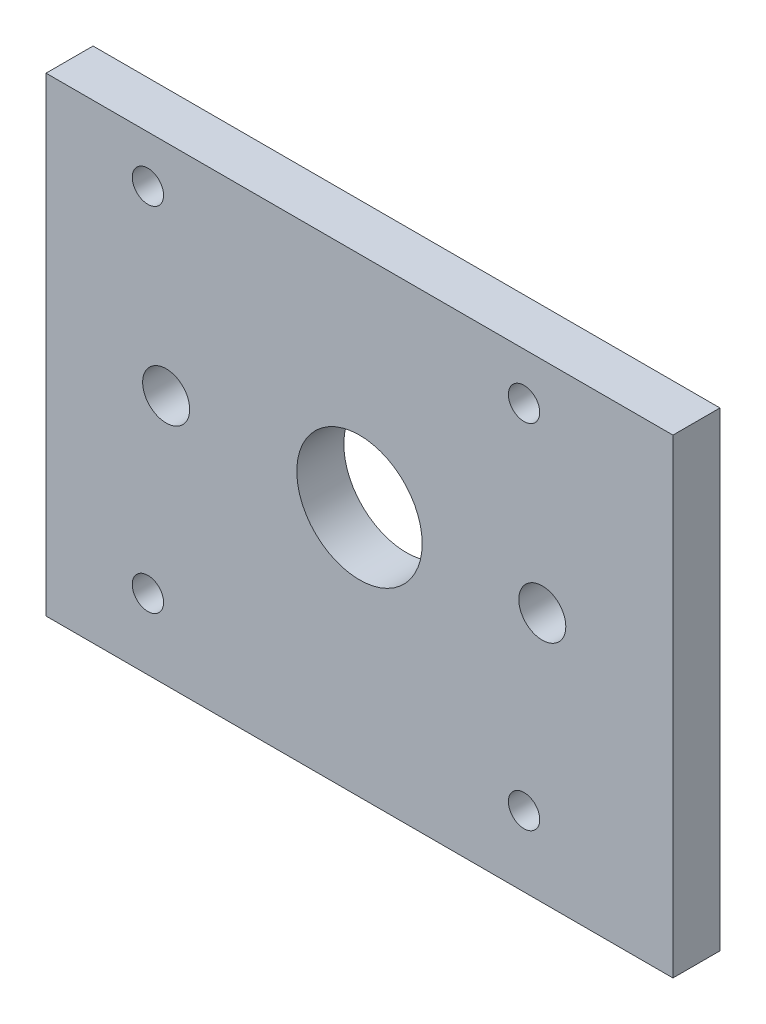
ISO-10303-21;
HEADER;
FILE_DESCRIPTION(('STEP AP214'),'2;1');
FILE_NAME('part.step','',(''),(''),'','','');
FILE_SCHEMA(('AUTOMOTIVE_DESIGN { 1 0 10303 214 1 1 1 1 }'));
ENDSEC;
DATA;
#1=APPLICATION_CONTEXT('core data for automotive mechanical design processes');
#2=APPLICATION_PROTOCOL_DEFINITION('international standard','automotive_design',2000,#1);
#3=PRODUCT_CONTEXT('',#1,'mechanical');
#4=PRODUCT('Part','Part','',(#3));
#5=PRODUCT_RELATED_PRODUCT_CATEGORY('part','',(#4));
#6=PRODUCT_DEFINITION_FORMATION('','',#4);
#7=PRODUCT_DEFINITION_CONTEXT('part definition',#1,'design');
#8=PRODUCT_DEFINITION('design','',#6,#7);
#9=PRODUCT_DEFINITION_SHAPE('','',#8);
#10=(LENGTH_UNIT() NAMED_UNIT(*) SI_UNIT(.MILLI.,.METRE.));
#11=(NAMED_UNIT(*) PLANE_ANGLE_UNIT() SI_UNIT($,.RADIAN.));
#12=(NAMED_UNIT(*) SI_UNIT($,.STERADIAN.) SOLID_ANGLE_UNIT());
#13=UNCERTAINTY_MEASURE_WITH_UNIT(LENGTH_MEASURE(1.E-05),#10,'distance_accuracy_value','');
#14=(GEOMETRIC_REPRESENTATION_CONTEXT(3) GLOBAL_UNCERTAINTY_ASSIGNED_CONTEXT((#13)) GLOBAL_UNIT_ASSIGNED_CONTEXT((#10,
#11,#12)) REPRESENTATION_CONTEXT('',''));
#15=CARTESIAN_POINT('',(0.,0.,0.));
#16=DIRECTION('',(0.,0.,1.));
#17=DIRECTION('',(1.,0.,0.));
#18=AXIS2_PLACEMENT_3D('',#15,#16,#17);
#19=CARTESIAN_POINT('',(0.,0.,6.));
#20=DIRECTION('',(0.,0.,-1.));
#21=DIRECTION('',(-1.,0.,0.));
#22=AXIS2_PLACEMENT_3D('',#19,#20,#21);
#23=PLANE('',#22);
#24=DIRECTION('',(-1.,0.,0.));
#25=VECTOR('',#24,1.);
#26=CARTESIAN_POINT('',(-40.0000000000308,35.0000000000011,6.));
#27=LINE('',#26,#25);
#28=CARTESIAN_POINT('',(39.9999999999692,34.9999999999994,6.));
#29=VERTEX_POINT('',#28);
#30=CARTESIAN_POINT('',(-40.0000000000308,35.0000000000011,6.));
#31=VERTEX_POINT('',#30);
#32=EDGE_CURVE('E87',#29,#31,#27,.T.);
#33=ORIENTED_EDGE('',*,*,#32,.T.);
#34=DIRECTION('',(0.,-1.,0.));
#35=VECTOR('',#34,1.);
#36=CARTESIAN_POINT('',(-40.0000000000308,-24.9999999999989,6.));
#37=LINE('',#36,#35);
#38=CARTESIAN_POINT('',(-40.0000000000308,-24.9999999999989,6.));
#39=VERTEX_POINT('',#38);
#40=EDGE_CURVE('E82',#31,#39,#37,.T.);
#41=ORIENTED_EDGE('',*,*,#40,.T.);
#42=DIRECTION('',(1.,0.,0.));
#43=VECTOR('',#42,1.);
#44=CARTESIAN_POINT('',(-40.0000000000308,-24.9999999999989,6.));
#45=LINE('',#44,#43);
#46=CARTESIAN_POINT('',(39.9999999999692,-24.9999999999989,6.));
#47=VERTEX_POINT('',#46);
#48=EDGE_CURVE('E85',#39,#47,#45,.T.);
#49=ORIENTED_EDGE('',*,*,#48,.T.);
#50=DIRECTION('',(0.,1.,0.));
#51=VECTOR('',#50,1.);
#52=CARTESIAN_POINT('',(39.9999999999692,34.9999999999994,6.));
#53=LINE('',#52,#51);
#54=EDGE_CURVE('E52',#47,#29,#53,.T.);
#55=ORIENTED_EDGE('',*,*,#54,.T.);
#56=EDGE_LOOP('',(#33,#41,#49,#55));
#57=FACE_BOUND('',#56,.T.);
#58=CARTESIAN_POINT('',(23.3281212579748,6.99999999999923,6.));
#59=DIRECTION('',(0.,0.,1.));
#60=DIRECTION('',(1.,0.,0.));
#61=AXIS2_PLACEMENT_3D('',#58,#59,#60);
#62=CIRCLE('',#61,3.00000000000001);
#63=CARTESIAN_POINT('',(26.3281212579749,6.99999999999923,6.));
#64=VERTEX_POINT('',#63);
#65=EDGE_CURVE('E102',#64,#64,#62,.T.);
#66=ORIENTED_EDGE('',*,*,#65,.F.);
#67=EDGE_LOOP('',(#66));
#68=FACE_BOUND('',#67,.T.);
#69=CARTESIAN_POINT('',(-24.6718787420252,6.99999999999923,6.));
#70=DIRECTION('',(0.,0.,1.));
#71=DIRECTION('',(1.,0.,0.));
#72=AXIS2_PLACEMENT_3D('',#69,#70,#71);
#73=CIRCLE('',#72,2.99999999999999);
#74=CARTESIAN_POINT('',(-21.6718787420252,6.99999999999923,6.));
#75=VERTEX_POINT('',#74);
#76=EDGE_CURVE('E117',#75,#75,#73,.T.);
#77=ORIENTED_EDGE('',*,*,#76,.F.);
#78=EDGE_LOOP('',(#77));
#79=FACE_BOUND('',#78,.T.);
#80=CARTESIAN_POINT('',(-27.0000000000308,29.0000000000011,6.));
#81=DIRECTION('',(0.,0.,1.));
#82=DIRECTION('',(1.,0.,0.));
#83=AXIS2_PLACEMENT_3D('',#80,#81,#82);
#84=CIRCLE('',#83,1.99999999999861);
#85=CARTESIAN_POINT('',(-25.0000000000322,29.0000000000011,6.));
#86=VERTEX_POINT('',#85);
#87=EDGE_CURVE('E123',#86,#86,#84,.T.);
#88=ORIENTED_EDGE('',*,*,#87,.F.);
#89=EDGE_LOOP('',(#88));
#90=FACE_BOUND('',#89,.T.);
#91=CARTESIAN_POINT('',(20.9999999999692,29.0000000000011,6.));
#92=DIRECTION('',(0.,0.,1.));
#93=DIRECTION('',(1.,0.,0.));
#94=AXIS2_PLACEMENT_3D('',#91,#92,#93);
#95=CIRCLE('',#94,1.99999999999861);
#96=CARTESIAN_POINT('',(22.9999999999678,29.0000000000011,6.));
#97=VERTEX_POINT('',#96);
#98=EDGE_CURVE('E129',#97,#97,#95,.T.);
#99=ORIENTED_EDGE('',*,*,#98,.F.);
#100=EDGE_LOOP('',(#99));
#101=FACE_BOUND('',#100,.T.);
#102=CARTESIAN_POINT('',(20.9999999999692,-15.9999999999989,6.));
#103=DIRECTION('',(0.,0.,1.));
#104=DIRECTION('',(1.,0.,0.));
#105=AXIS2_PLACEMENT_3D('',#102,#103,#104);
#106=CIRCLE('',#105,1.99999999999861);
#107=CARTESIAN_POINT('',(22.9999999999678,-15.9999999999989,6.));
#108=VERTEX_POINT('',#107);
#109=EDGE_CURVE('E135',#108,#108,#106,.T.);
#110=ORIENTED_EDGE('',*,*,#109,.F.);
#111=EDGE_LOOP('',(#110));
#112=FACE_BOUND('',#111,.T.);
#113=CARTESIAN_POINT('',(-27.0000000000308,-15.9999999999989,6.));
#114=DIRECTION('',(0.,0.,1.));
#115=DIRECTION('',(1.,0.,0.));
#116=AXIS2_PLACEMENT_3D('',#113,#114,#115);
#117=CIRCLE('',#116,1.99999999999899);
#118=CARTESIAN_POINT('',(-25.0000000000318,-15.9999999999989,6.));
#119=VERTEX_POINT('',#118);
#120=EDGE_CURVE('E141',#119,#119,#117,.T.);
#121=ORIENTED_EDGE('',*,*,#120,.F.);
#122=EDGE_LOOP('',(#121));
#123=FACE_BOUND('',#122,.T.);
#124=CARTESIAN_POINT('',(-3.13596870453245E-11,7.00000000000025,6.));
#125=DIRECTION('',(0.,0.,1.));
#126=DIRECTION('',(1.,0.,0.));
#127=AXIS2_PLACEMENT_3D('',#124,#125,#126);
#128=CIRCLE('',#127,8.);
#129=CARTESIAN_POINT('',(7.99999999996864,7.00000000000025,6.));
#130=VERTEX_POINT('',#129);
#131=EDGE_CURVE('E147',#130,#130,#128,.T.);
#132=ORIENTED_EDGE('',*,*,#131,.F.);
#133=EDGE_LOOP('',(#132));
#134=FACE_BOUND('',#133,.T.);
#135=ADVANCED_FACE('F35',(#57,#68,#79,#90,#101,#112,#123,#134),#23,.F.);
#136=CARTESIAN_POINT('',(0.,0.,0.));
#137=DIRECTION('',(0.,0.,-1.));
#138=DIRECTION('',(-1.,0.,0.));
#139=AXIS2_PLACEMENT_3D('',#136,#137,#138);
#140=PLANE('',#139);
#141=CARTESIAN_POINT('',(-27.0000000000308,-15.9999999999989,0.));
#142=DIRECTION('',(0.,0.,1.));
#143=DIRECTION('',(1.,0.,0.));
#144=AXIS2_PLACEMENT_3D('',#141,#142,#143);
#145=CIRCLE('',#144,1.99999999999899);
#146=CARTESIAN_POINT('',(-25.0000000000318,-15.9999999999989,0.));
#147=VERTEX_POINT('',#146);
#148=EDGE_CURVE('E144',#147,#147,#145,.T.);
#149=ORIENTED_EDGE('',*,*,#148,.T.);
#150=EDGE_LOOP('',(#149));
#151=FACE_BOUND('',#150,.T.);
#152=CARTESIAN_POINT('',(20.9999999999692,29.0000000000011,0.));
#153=DIRECTION('',(0.,0.,1.));
#154=DIRECTION('',(1.,0.,0.));
#155=AXIS2_PLACEMENT_3D('',#152,#153,#154);
#156=CIRCLE('',#155,1.99999999999861);
#157=CARTESIAN_POINT('',(22.9999999999678,29.0000000000011,0.));
#158=VERTEX_POINT('',#157);
#159=EDGE_CURVE('E132',#158,#158,#156,.T.);
#160=ORIENTED_EDGE('',*,*,#159,.T.);
#161=EDGE_LOOP('',(#160));
#162=FACE_BOUND('',#161,.T.);
#163=CARTESIAN_POINT('',(-24.6718787420252,6.99999999999923,0.));
#164=DIRECTION('',(0.,0.,1.));
#165=DIRECTION('',(1.,0.,0.));
#166=AXIS2_PLACEMENT_3D('',#163,#164,#165);
#167=CIRCLE('',#166,2.99999999999999);
#168=CARTESIAN_POINT('',(-21.6718787420252,6.99999999999923,0.));
#169=VERTEX_POINT('',#168);
#170=EDGE_CURVE('E120',#169,#169,#167,.T.);
#171=ORIENTED_EDGE('',*,*,#170,.T.);
#172=EDGE_LOOP('',(#171));
#173=FACE_BOUND('',#172,.T.);
#174=DIRECTION('',(-1.,0.,0.));
#175=VECTOR('',#174,1.);
#176=CARTESIAN_POINT('',(-40.0000000000308,35.0000000000011,0.));
#177=LINE('',#176,#175);
#178=CARTESIAN_POINT('',(39.9999999999692,34.9999999999994,0.));
#179=VERTEX_POINT('',#178);
#180=CARTESIAN_POINT('',(-40.0000000000308,35.0000000000011,0.));
#181=VERTEX_POINT('',#180);
#182=EDGE_CURVE('E99',#179,#181,#177,.T.);
#183=ORIENTED_EDGE('',*,*,#182,.F.);
#184=DIRECTION('',(0.,1.,0.));
#185=VECTOR('',#184,1.);
#186=CARTESIAN_POINT('',(39.9999999999692,34.9999999999994,0.));
#187=LINE('',#186,#185);
#188=CARTESIAN_POINT('',(39.9999999999692,-24.9999999999989,0.));
#189=VERTEX_POINT('',#188);
#190=EDGE_CURVE('E75',#189,#179,#187,.T.);
#191=ORIENTED_EDGE('',*,*,#190,.F.);
#192=DIRECTION('',(1.,0.,0.));
#193=VECTOR('',#192,1.);
#194=CARTESIAN_POINT('',(-40.0000000000308,-24.9999999999989,0.));
#195=LINE('',#194,#193);
#196=CARTESIAN_POINT('',(-40.0000000000308,-24.9999999999989,0.));
#197=VERTEX_POINT('',#196);
#198=EDGE_CURVE('E69',#197,#189,#195,.T.);
#199=ORIENTED_EDGE('',*,*,#198,.F.);
#200=DIRECTION('',(0.,-1.,0.));
#201=VECTOR('',#200,1.);
#202=CARTESIAN_POINT('',(-40.0000000000308,-24.9999999999989,0.));
#203=LINE('',#202,#201);
#204=EDGE_CURVE('E91',#181,#197,#203,.T.);
#205=ORIENTED_EDGE('',*,*,#204,.F.);
#206=EDGE_LOOP('',(#183,#191,#199,#205));
#207=FACE_BOUND('',#206,.T.);
#208=CARTESIAN_POINT('',(23.3281212579748,6.99999999999923,0.));
#209=DIRECTION('',(0.,0.,1.));
#210=DIRECTION('',(1.,0.,0.));
#211=AXIS2_PLACEMENT_3D('',#208,#209,#210);
#212=CIRCLE('',#211,3.00000000000001);
#213=CARTESIAN_POINT('',(26.3281212579749,6.99999999999923,0.));
#214=VERTEX_POINT('',#213);
#215=EDGE_CURVE('E114',#214,#214,#212,.T.);
#216=ORIENTED_EDGE('',*,*,#215,.T.);
#217=EDGE_LOOP('',(#216));
#218=FACE_BOUND('',#217,.T.);
#219=CARTESIAN_POINT('',(-27.0000000000308,29.0000000000011,0.));
#220=DIRECTION('',(0.,0.,1.));
#221=DIRECTION('',(1.,0.,0.));
#222=AXIS2_PLACEMENT_3D('',#219,#220,#221);
#223=CIRCLE('',#222,1.99999999999861);
#224=CARTESIAN_POINT('',(-25.0000000000322,29.0000000000011,0.));
#225=VERTEX_POINT('',#224);
#226=EDGE_CURVE('E126',#225,#225,#223,.T.);
#227=ORIENTED_EDGE('',*,*,#226,.T.);
#228=EDGE_LOOP('',(#227));
#229=FACE_BOUND('',#228,.T.);
#230=CARTESIAN_POINT('',(20.9999999999692,-15.9999999999989,0.));
#231=DIRECTION('',(0.,0.,1.));
#232=DIRECTION('',(1.,0.,0.));
#233=AXIS2_PLACEMENT_3D('',#230,#231,#232);
#234=CIRCLE('',#233,1.99999999999861);
#235=CARTESIAN_POINT('',(22.9999999999678,-15.9999999999989,0.));
#236=VERTEX_POINT('',#235);
#237=EDGE_CURVE('E138',#236,#236,#234,.T.);
#238=ORIENTED_EDGE('',*,*,#237,.T.);
#239=EDGE_LOOP('',(#238));
#240=FACE_BOUND('',#239,.T.);
#241=CARTESIAN_POINT('',(-3.13596870453245E-11,7.00000000000025,0.));
#242=DIRECTION('',(0.,0.,1.));
#243=DIRECTION('',(1.,0.,0.));
#244=AXIS2_PLACEMENT_3D('',#241,#242,#243);
#245=CIRCLE('',#244,8.);
#246=CARTESIAN_POINT('',(7.99999999996864,7.00000000000025,0.));
#247=VERTEX_POINT('',#246);
#248=EDGE_CURVE('E150',#247,#247,#245,.T.);
#249=ORIENTED_EDGE('',*,*,#248,.T.);
#250=EDGE_LOOP('',(#249));
#251=FACE_BOUND('',#250,.T.);
#252=ADVANCED_FACE('F110',(#151,#162,#173,#207,#218,#229,#240,#251),#140,.T.);
#253=CARTESIAN_POINT('',(-40.0000000000308,35.0000000000011,6.));
#254=DIRECTION('',(0.,-1.,0.));
#255=DIRECTION('',(1.,0.,0.));
#256=AXIS2_PLACEMENT_3D('',#253,#254,#255);
#257=PLANE('',#256);
#258=ORIENTED_EDGE('',*,*,#182,.T.);
#259=DIRECTION('',(0.,0.,-1.));
#260=VECTOR('',#259,1.);
#261=CARTESIAN_POINT('',(-40.0000000000308,35.0000000000011,6.));
#262=LINE('',#261,#260);
#263=EDGE_CURVE('E11',#31,#181,#262,.T.);
#264=ORIENTED_EDGE('',*,*,#263,.F.);
#265=ORIENTED_EDGE('',*,*,#32,.F.);
#266=DIRECTION('',(0.,0.,-1.));
#267=VECTOR('',#266,1.);
#268=CARTESIAN_POINT('',(39.9999999999692,34.9999999999994,6.));
#269=LINE('',#268,#267);
#270=EDGE_CURVE('E95',#29,#179,#269,.T.);
#271=ORIENTED_EDGE('',*,*,#270,.T.);
#272=EDGE_LOOP('',(#258,#264,#265,#271));
#273=FACE_BOUND('',#272,.T.);
#274=ADVANCED_FACE('F37',(#273),#257,.F.);
#275=CARTESIAN_POINT('',(-40.0000000000308,-24.9999999999989,6.));
#276=DIRECTION('',(1.,0.,0.));
#277=DIRECTION('',(0.,0.,-1.));
#278=AXIS2_PLACEMENT_3D('',#275,#276,#277);
#279=PLANE('',#278);
#280=ORIENTED_EDGE('',*,*,#204,.T.);
#281=DIRECTION('',(0.,0.,-1.));
#282=VECTOR('',#281,1.);
#283=CARTESIAN_POINT('',(-40.0000000000308,-24.9999999999989,6.));
#284=LINE('',#283,#282);
#285=EDGE_CURVE('E44',#39,#197,#284,.T.);
#286=ORIENTED_EDGE('',*,*,#285,.F.);
#287=ORIENTED_EDGE('',*,*,#40,.F.);
#288=ORIENTED_EDGE('',*,*,#263,.T.);
#289=EDGE_LOOP('',(#280,#286,#287,#288));
#290=FACE_BOUND('',#289,.T.);
#291=ADVANCED_FACE('F90',(#290),#279,.F.);
#292=CARTESIAN_POINT('',(-40.0000000000308,-24.9999999999989,6.));
#293=DIRECTION('',(0.,1.,0.));
#294=DIRECTION('',(0.,0.,1.));
#295=AXIS2_PLACEMENT_3D('',#292,#293,#294);
#296=PLANE('',#295);
#297=ORIENTED_EDGE('',*,*,#198,.T.);
#298=DIRECTION('',(0.,0.,-1.));
#299=VECTOR('',#298,1.);
#300=CARTESIAN_POINT('',(39.9999999999692,-24.9999999999989,6.));
#301=LINE('',#300,#299);
#302=EDGE_CURVE('E92',#47,#189,#301,.T.);
#303=ORIENTED_EDGE('',*,*,#302,.F.);
#304=ORIENTED_EDGE('',*,*,#48,.F.);
#305=ORIENTED_EDGE('',*,*,#285,.T.);
#306=EDGE_LOOP('',(#297,#303,#304,#305));
#307=FACE_BOUND('',#306,.T.);
#308=ADVANCED_FACE('F93',(#307),#296,.F.);
#309=CARTESIAN_POINT('',(39.9999999999692,34.9999999999994,6.));
#310=DIRECTION('',(-1.,0.,0.));
#311=DIRECTION('',(0.,-1.,0.));
#312=AXIS2_PLACEMENT_3D('',#309,#310,#311);
#313=PLANE('',#312);
#314=ORIENTED_EDGE('',*,*,#190,.T.);
#315=ORIENTED_EDGE('',*,*,#270,.F.);
#316=ORIENTED_EDGE('',*,*,#54,.F.);
#317=ORIENTED_EDGE('',*,*,#302,.T.);
#318=EDGE_LOOP('',(#314,#315,#316,#317));
#319=FACE_BOUND('',#318,.T.);
#320=ADVANCED_FACE('F107',(#319),#313,.F.);
#321=CARTESIAN_POINT('',(23.3281212579748,6.99999999999923,6.));
#322=DIRECTION('',(0.,0.,-1.));
#323=DIRECTION('',(-1.,0.,0.));
#324=AXIS2_PLACEMENT_3D('',#321,#322,#323);
#325=CYLINDRICAL_SURFACE('',#324,3.00000000000001);
#326=ORIENTED_EDGE('',*,*,#65,.T.);
#327=EDGE_LOOP('',(#326));
#328=FACE_BOUND('',#327,.T.);
#329=ORIENTED_EDGE('',*,*,#215,.F.);
#330=EDGE_LOOP('',(#329));
#331=FACE_BOUND('',#330,.T.);
#332=ADVANCED_FACE('F167',(#328,#331),#325,.F.);
#333=CARTESIAN_POINT('',(-24.6718787420252,6.99999999999923,6.));
#334=DIRECTION('',(0.,0.,-1.));
#335=DIRECTION('',(-1.,0.,0.));
#336=AXIS2_PLACEMENT_3D('',#333,#334,#335);
#337=CYLINDRICAL_SURFACE('',#336,2.99999999999999);
#338=ORIENTED_EDGE('',*,*,#76,.T.);
#339=EDGE_LOOP('',(#338));
#340=FACE_BOUND('',#339,.T.);
#341=ORIENTED_EDGE('',*,*,#170,.F.);
#342=EDGE_LOOP('',(#341));
#343=FACE_BOUND('',#342,.T.);
#344=ADVANCED_FACE('F213',(#340,#343),#337,.F.);
#345=CARTESIAN_POINT('',(-27.0000000000308,29.0000000000011,6.));
#346=DIRECTION('',(0.,0.,-1.));
#347=DIRECTION('',(-1.,0.,0.));
#348=AXIS2_PLACEMENT_3D('',#345,#346,#347);
#349=CYLINDRICAL_SURFACE('',#348,1.99999999999861);
#350=ORIENTED_EDGE('',*,*,#87,.T.);
#351=EDGE_LOOP('',(#350));
#352=FACE_BOUND('',#351,.T.);
#353=ORIENTED_EDGE('',*,*,#226,.F.);
#354=EDGE_LOOP('',(#353));
#355=FACE_BOUND('',#354,.T.);
#356=ADVANCED_FACE('F221',(#352,#355),#349,.F.);
#357=CARTESIAN_POINT('',(20.9999999999692,29.0000000000011,6.));
#358=DIRECTION('',(0.,0.,-1.));
#359=DIRECTION('',(-1.,0.,0.));
#360=AXIS2_PLACEMENT_3D('',#357,#358,#359);
#361=CYLINDRICAL_SURFACE('',#360,1.99999999999861);
#362=ORIENTED_EDGE('',*,*,#98,.T.);
#363=EDGE_LOOP('',(#362));
#364=FACE_BOUND('',#363,.T.);
#365=ORIENTED_EDGE('',*,*,#159,.F.);
#366=EDGE_LOOP('',(#365));
#367=FACE_BOUND('',#366,.T.);
#368=ADVANCED_FACE('F229',(#364,#367),#361,.F.);
#369=CARTESIAN_POINT('',(20.9999999999692,-15.9999999999989,6.));
#370=DIRECTION('',(0.,0.,-1.));
#371=DIRECTION('',(-1.,0.,0.));
#372=AXIS2_PLACEMENT_3D('',#369,#370,#371);
#373=CYLINDRICAL_SURFACE('',#372,1.99999999999861);
#374=ORIENTED_EDGE('',*,*,#109,.T.);
#375=EDGE_LOOP('',(#374));
#376=FACE_BOUND('',#375,.T.);
#377=ORIENTED_EDGE('',*,*,#237,.F.);
#378=EDGE_LOOP('',(#377));
#379=FACE_BOUND('',#378,.T.);
#380=ADVANCED_FACE('F238',(#376,#379),#373,.F.);
#381=CARTESIAN_POINT('',(-27.0000000000308,-15.9999999999989,6.));
#382=DIRECTION('',(0.,0.,-1.));
#383=DIRECTION('',(-1.,0.,0.));
#384=AXIS2_PLACEMENT_3D('',#381,#382,#383);
#385=CYLINDRICAL_SURFACE('',#384,1.99999999999899);
#386=ORIENTED_EDGE('',*,*,#120,.T.);
#387=EDGE_LOOP('',(#386));
#388=FACE_BOUND('',#387,.T.);
#389=ORIENTED_EDGE('',*,*,#148,.F.);
#390=EDGE_LOOP('',(#389));
#391=FACE_BOUND('',#390,.T.);
#392=ADVANCED_FACE('F247',(#388,#391),#385,.F.);
#393=CARTESIAN_POINT('',(-3.13596870453245E-11,7.00000000000025,6.));
#394=DIRECTION('',(0.,0.,-1.));
#395=DIRECTION('',(-1.,0.,0.));
#396=AXIS2_PLACEMENT_3D('',#393,#394,#395);
#397=CYLINDRICAL_SURFACE('',#396,8.);
#398=ORIENTED_EDGE('',*,*,#131,.T.);
#399=EDGE_LOOP('',(#398));
#400=FACE_BOUND('',#399,.T.);
#401=ORIENTED_EDGE('',*,*,#248,.F.);
#402=EDGE_LOOP('',(#401));
#403=FACE_BOUND('',#402,.T.);
#404=ADVANCED_FACE('F156',(#400,#403),#397,.F.);
#405=CLOSED_SHELL('',(#135,#252,#274,#291,#308,#320,#332,#344,#356,#368,#380,#392,#404));
#406=MANIFOLD_SOLID_BREP('B2',#405);
#407=ADVANCED_BREP_SHAPE_REPRESENTATION('',(#18,#406),#14);
#408=SHAPE_DEFINITION_REPRESENTATION(#9,#407);
ENDSEC;
END-ISO-10303-21;
